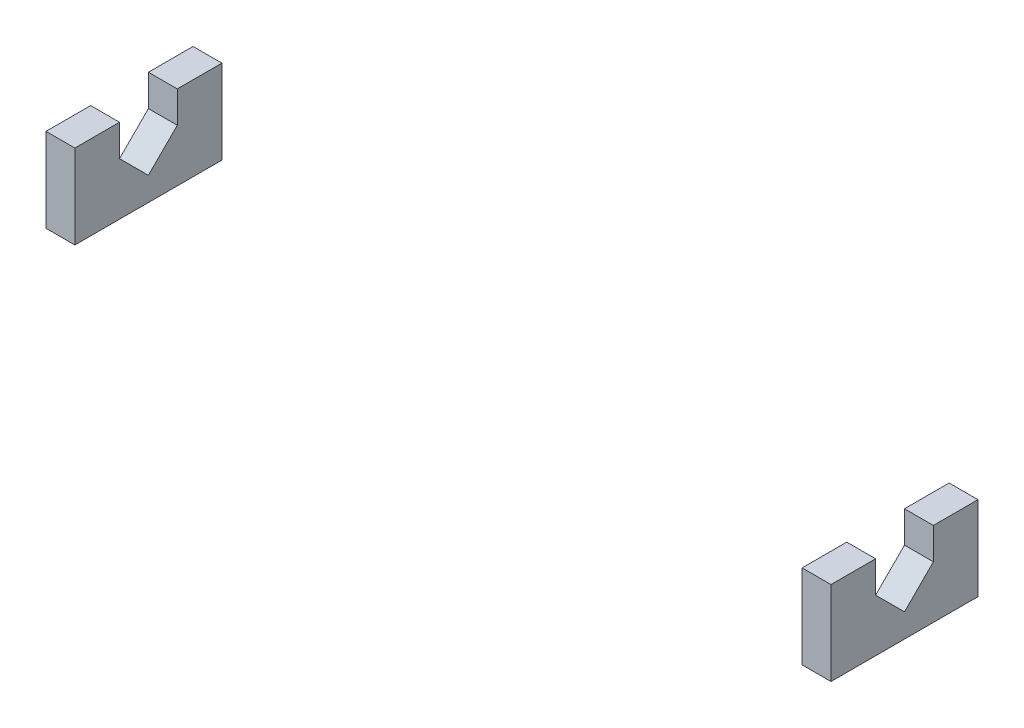
ISO-10303-21;
HEADER;
FILE_DESCRIPTION(('STEP AP214'),'2;1');
FILE_NAME('part.step','',(''),(''),'','','');
FILE_SCHEMA(('AUTOMOTIVE_DESIGN { 1 0 10303 214 1 1 1 1 }'));
ENDSEC;
DATA;
#1=APPLICATION_CONTEXT('core data for automotive mechanical design processes');
#2=APPLICATION_PROTOCOL_DEFINITION('international standard','automotive_design',2000,#1);
#3=PRODUCT_CONTEXT('',#1,'mechanical');
#4=PRODUCT('Part','Part','',(#3));
#5=PRODUCT_RELATED_PRODUCT_CATEGORY('part','',(#4));
#6=PRODUCT_DEFINITION_FORMATION('','',#4);
#7=PRODUCT_DEFINITION_CONTEXT('part definition',#1,'design');
#8=PRODUCT_DEFINITION('design','',#6,#7);
#9=PRODUCT_DEFINITION_SHAPE('','',#8);
#10=(LENGTH_UNIT() NAMED_UNIT(*) SI_UNIT(.MILLI.,.METRE.));
#11=(NAMED_UNIT(*) PLANE_ANGLE_UNIT() SI_UNIT($,.RADIAN.));
#12=(NAMED_UNIT(*) SI_UNIT($,.STERADIAN.) SOLID_ANGLE_UNIT());
#13=UNCERTAINTY_MEASURE_WITH_UNIT(LENGTH_MEASURE(1.E-05),#10,'distance_accuracy_value','');
#14=(GEOMETRIC_REPRESENTATION_CONTEXT(3) GLOBAL_UNCERTAINTY_ASSIGNED_CONTEXT((#13)) GLOBAL_UNIT_ASSIGNED_CONTEXT((#10,
#11,#12)) REPRESENTATION_CONTEXT('',''));
#15=CARTESIAN_POINT('',(0.,0.,0.));
#16=DIRECTION('',(0.,0.,1.));
#17=DIRECTION('',(1.,0.,0.));
#18=AXIS2_PLACEMENT_3D('',#15,#16,#17);
#19=CARTESIAN_POINT('',(474.6625,0.,-1.11022302462516E-13));
#20=DIRECTION('',(0.,0.,-1.));
#21=DIRECTION('',(0.,1.,0.));
#22=AXIS2_PLACEMENT_3D('',#19,#20,#21);
#23=PLANE('',#22);
#24=DIRECTION('',(0.,-1.,0.));
#25=VECTOR('',#24,1.);
#26=CARTESIAN_POINT('',(457.2,0.,-1.11022302462516E-13));
#27=LINE('',#26,#25);
#28=CARTESIAN_POINT('',(457.2,50.8,1.77367252013235E-13));
#29=VERTEX_POINT('',#28);
#30=CARTESIAN_POINT('',(457.2,0.,-1.11022302462516E-13));
#31=VERTEX_POINT('',#30);
#32=EDGE_CURVE('E149',#29,#31,#27,.T.);
#33=ORIENTED_EDGE('',*,*,#32,.T.);
#34=DIRECTION('',(-1.,0.,0.));
#35=VECTOR('',#34,1.);
#36=CARTESIAN_POINT('',(474.6625,0.,-1.11022302462516E-13));
#37=LINE('',#36,#35);
#38=CARTESIAN_POINT('',(474.6625,0.,-1.11022302462516E-13));
#39=VERTEX_POINT('',#38);
#40=EDGE_CURVE('E12',#39,#31,#37,.T.);
#41=ORIENTED_EDGE('',*,*,#40,.F.);
#42=DIRECTION('',(0.,-1.,0.));
#43=VECTOR('',#42,1.);
#44=CARTESIAN_POINT('',(474.6625,0.,-1.11022302462516E-13));
#45=LINE('',#44,#43);
#46=CARTESIAN_POINT('',(474.6625,50.8,1.77367252013235E-13));
#47=VERTEX_POINT('',#46);
#48=EDGE_CURVE('E165',#47,#39,#45,.T.);
#49=ORIENTED_EDGE('',*,*,#48,.F.);
#50=DIRECTION('',(-1.,0.,0.));
#51=VECTOR('',#50,1.);
#52=CARTESIAN_POINT('',(474.6625,50.8,1.77367252013235E-13));
#53=LINE('',#52,#51);
#54=EDGE_CURVE('E145',#47,#29,#53,.T.);
#55=ORIENTED_EDGE('',*,*,#54,.T.);
#56=EDGE_LOOP('',(#33,#41,#49,#55));
#57=FACE_BOUND('',#56,.T.);
#58=ADVANCED_FACE('F47',(#57),#23,.F.);
#59=CARTESIAN_POINT('',(474.6625,0.,-1.11022302462516E-13));
#60=DIRECTION('',(0.,1.,0.));
#61=DIRECTION('',(0.,0.,1.));
#62=AXIS2_PLACEMENT_3D('',#59,#60,#61);
#63=PLANE('',#62);
#64=DIRECTION('',(0.,0.,-1.));
#65=VECTOR('',#64,1.);
#66=CARTESIAN_POINT('',(457.2,0.,-1.11022302462516E-13));
#67=LINE('',#66,#65);
#68=CARTESIAN_POINT('',(457.2,3.04141951886577E-13,-88.9000000000001));
#69=VERTEX_POINT('',#68);
#70=EDGE_CURVE('E152',#31,#69,#67,.T.);
#71=ORIENTED_EDGE('',*,*,#70,.T.);
#72=DIRECTION('',(-1.,0.,0.));
#73=VECTOR('',#72,1.);
#74=CARTESIAN_POINT('',(474.6625,3.04141951886577E-13,-88.9000000000001));
#75=LINE('',#74,#73);
#76=CARTESIAN_POINT('',(474.6625,3.04141951886577E-13,-88.9000000000001));
#77=VERTEX_POINT('',#76);
#78=EDGE_CURVE('E55',#77,#69,#75,.T.);
#79=ORIENTED_EDGE('',*,*,#78,.F.);
#80=DIRECTION('',(0.,0.,-1.));
#81=VECTOR('',#80,1.);
#82=CARTESIAN_POINT('',(474.6625,0.,-1.11022302462516E-13));
#83=LINE('',#82,#81);
#84=EDGE_CURVE('E109',#39,#77,#83,.T.);
#85=ORIENTED_EDGE('',*,*,#84,.F.);
#86=ORIENTED_EDGE('',*,*,#40,.T.);
#87=EDGE_LOOP('',(#71,#79,#85,#86));
#88=FACE_BOUND('',#87,.T.);
#89=ADVANCED_FACE('F208',(#88),#63,.F.);
#90=CARTESIAN_POINT('',(474.6625,3.04141951886577E-13,-88.9000000000001));
#91=DIRECTION('',(0.,0.,1.));
#92=DIRECTION('',(0.,-1.,0.));
#93=AXIS2_PLACEMENT_3D('',#90,#91,#92);
#94=PLANE('',#93);
#95=DIRECTION('',(0.,1.,0.));
#96=VECTOR('',#95,1.);
#97=CARTESIAN_POINT('',(457.2,3.04141951886577E-13,-88.9000000000001));
#98=LINE('',#97,#96);
#99=CARTESIAN_POINT('',(457.2,50.8000000000003,-88.8999999999999));
#100=VERTEX_POINT('',#99);
#101=EDGE_CURVE('E154',#69,#100,#98,.T.);
#102=ORIENTED_EDGE('',*,*,#101,.T.);
#103=DIRECTION('',(-1.,0.,0.));
#104=VECTOR('',#103,1.);
#105=CARTESIAN_POINT('',(474.6625,50.8000000000003,-88.8999999999999));
#106=LINE('',#105,#104);
#107=CARTESIAN_POINT('',(474.6625,50.8000000000003,-88.8999999999999));
#108=VERTEX_POINT('',#107);
#109=EDGE_CURVE('E175',#108,#100,#106,.T.);
#110=ORIENTED_EDGE('',*,*,#109,.F.);
#111=DIRECTION('',(0.,1.,0.));
#112=VECTOR('',#111,1.);
#113=CARTESIAN_POINT('',(474.6625,3.04141951886577E-13,-88.9000000000001));
#114=LINE('',#113,#112);
#115=EDGE_CURVE('E183',#77,#108,#114,.T.);
#116=ORIENTED_EDGE('',*,*,#115,.F.);
#117=ORIENTED_EDGE('',*,*,#78,.T.);
#118=EDGE_LOOP('',(#102,#110,#116,#117));
#119=FACE_BOUND('',#118,.T.);
#120=ADVANCED_FACE('F181',(#119),#94,.F.);
#121=CARTESIAN_POINT('',(474.6625,50.8000000000002,-61.9124999999998));
#122=DIRECTION('',(0.,-1.,0.));
#123=DIRECTION('',(0.,0.,-1.));
#124=AXIS2_PLACEMENT_3D('',#121,#122,#123);
#125=PLANE('',#124);
#126=DIRECTION('',(0.,0.,1.));
#127=VECTOR('',#126,1.);
#128=CARTESIAN_POINT('',(457.2,50.8000000000002,-61.9124999999998));
#129=LINE('',#128,#127);
#130=CARTESIAN_POINT('',(457.2,50.8000000000002,-61.9124999999998));
#131=VERTEX_POINT('',#130);
#132=EDGE_CURVE('E156',#100,#131,#129,.T.);
#133=ORIENTED_EDGE('',*,*,#132,.T.);
#134=DIRECTION('',(-1.,0.,0.));
#135=VECTOR('',#134,1.);
#136=CARTESIAN_POINT('',(474.6625,50.8000000000002,-61.9124999999998));
#137=LINE('',#136,#135);
#138=CARTESIAN_POINT('',(474.6625,50.8000000000002,-61.9124999999998));
#139=VERTEX_POINT('',#138);
#140=EDGE_CURVE('E172',#139,#131,#137,.T.);
#141=ORIENTED_EDGE('',*,*,#140,.F.);
#142=DIRECTION('',(0.,0.,1.));
#143=VECTOR('',#142,1.);
#144=CARTESIAN_POINT('',(474.6625,50.8000000000002,-61.9124999999998));
#145=LINE('',#144,#143);
#146=EDGE_CURVE('E199',#108,#139,#145,.T.);
#147=ORIENTED_EDGE('',*,*,#146,.F.);
#148=ORIENTED_EDGE('',*,*,#109,.T.);
#149=EDGE_LOOP('',(#133,#141,#147,#148));
#150=FACE_BOUND('',#149,.T.);
#151=ADVANCED_FACE('F192',(#150),#125,.F.);
#152=CARTESIAN_POINT('',(474.6625,50.8000000000002,-61.9124999999998));
#153=DIRECTION('',(0.,0.,-1.));
#154=DIRECTION('',(0.,1.,0.));
#155=AXIS2_PLACEMENT_3D('',#152,#153,#154);
#156=PLANE('',#155);
#157=DIRECTION('',(0.,-1.,0.));
#158=VECTOR('',#157,1.);
#159=CARTESIAN_POINT('',(457.2,50.8000000000002,-61.9124999999998));
#160=LINE('',#159,#158);
#161=CARTESIAN_POINT('',(457.2,31.7500000000002,-61.9124999999999));
#162=VERTEX_POINT('',#161);
#163=EDGE_CURVE('E158',#131,#162,#160,.T.);
#164=ORIENTED_EDGE('',*,*,#163,.T.);
#165=DIRECTION('',(-1.,0.,0.));
#166=VECTOR('',#165,1.);
#167=CARTESIAN_POINT('',(474.6625,31.7500000000002,-61.9124999999999));
#168=LINE('',#167,#166);
#169=CARTESIAN_POINT('',(474.6625,31.7500000000002,-61.9124999999999));
#170=VERTEX_POINT('',#169);
#171=EDGE_CURVE('E169',#170,#162,#168,.T.);
#172=ORIENTED_EDGE('',*,*,#171,.F.);
#173=DIRECTION('',(0.,-1.,0.));
#174=VECTOR('',#173,1.);
#175=CARTESIAN_POINT('',(474.6625,50.8000000000002,-61.9124999999998));
#176=LINE('',#175,#174);
#177=EDGE_CURVE('E198',#139,#170,#176,.T.);
#178=ORIENTED_EDGE('',*,*,#177,.F.);
#179=ORIENTED_EDGE('',*,*,#140,.T.);
#180=EDGE_LOOP('',(#164,#172,#178,#179));
#181=FACE_BOUND('',#180,.T.);
#182=ADVANCED_FACE('F196',(#181),#156,.F.);
#183=CARTESIAN_POINT('',(474.6625,14.2875000000002,-44.4499999999999));
#184=DIRECTION('',(0.,-0.707106781186545,-0.70710678118655));
#185=DIRECTION('',(0.,0.70710678118655,-0.707106781186545));
#186=AXIS2_PLACEMENT_3D('',#183,#184,#185);
#187=PLANE('',#186);
#188=DIRECTION('',(0.,-0.70710678118655,0.707106781186545));
#189=VECTOR('',#188,1.);
#190=CARTESIAN_POINT('',(457.2,14.2875000000002,-44.4499999999999));
#191=LINE('',#190,#189);
#192=CARTESIAN_POINT('',(457.2,14.2875000000002,-44.4499999999999));
#193=VERTEX_POINT('',#192);
#194=EDGE_CURVE('E160',#162,#193,#191,.T.);
#195=ORIENTED_EDGE('',*,*,#194,.T.);
#196=DIRECTION('',(-1.,0.,0.));
#197=VECTOR('',#196,1.);
#198=CARTESIAN_POINT('',(474.6625,14.2875000000002,-44.4499999999999));
#199=LINE('',#198,#197);
#200=CARTESIAN_POINT('',(474.6625,14.2875000000002,-44.4499999999999));
#201=VERTEX_POINT('',#200);
#202=EDGE_CURVE('E140',#201,#193,#199,.T.);
#203=ORIENTED_EDGE('',*,*,#202,.F.);
#204=DIRECTION('',(0.,-0.70710678118655,0.707106781186545));
#205=VECTOR('',#204,1.);
#206=CARTESIAN_POINT('',(474.6625,14.2875000000002,-44.4499999999999));
#207=LINE('',#206,#205);
#208=EDGE_CURVE('E131',#170,#201,#207,.T.);
#209=ORIENTED_EDGE('',*,*,#208,.F.);
#210=ORIENTED_EDGE('',*,*,#171,.T.);
#211=EDGE_LOOP('',(#195,#203,#209,#210));
#212=FACE_BOUND('',#211,.T.);
#213=ADVANCED_FACE('F220',(#212),#187,.F.);
#214=CARTESIAN_POINT('',(474.6625,31.7500000000001,-26.9874999999999));
#215=DIRECTION('',(0.,-0.70710678118655,0.707106781186545));
#216=DIRECTION('',(0.,-0.707106781186545,-0.70710678118655));
#217=AXIS2_PLACEMENT_3D('',#214,#215,#216);
#218=PLANE('',#217);
#219=DIRECTION('',(0.,0.707106781186545,0.70710678118655));
#220=VECTOR('',#219,1.);
#221=CARTESIAN_POINT('',(457.2,31.7500000000001,-26.9874999999999));
#222=LINE('',#221,#220);
#223=CARTESIAN_POINT('',(457.2,31.7500000000001,-26.9874999999999));
#224=VERTEX_POINT('',#223);
#225=EDGE_CURVE('E139',#193,#224,#222,.T.);
#226=ORIENTED_EDGE('',*,*,#225,.T.);
#227=DIRECTION('',(-1.,0.,0.));
#228=VECTOR('',#227,1.);
#229=CARTESIAN_POINT('',(474.6625,31.7500000000001,-26.9874999999999));
#230=LINE('',#229,#228);
#231=CARTESIAN_POINT('',(474.6625,31.7500000000001,-26.9874999999999));
#232=VERTEX_POINT('',#231);
#233=EDGE_CURVE('E136',#232,#224,#230,.T.);
#234=ORIENTED_EDGE('',*,*,#233,.F.);
#235=DIRECTION('',(0.,0.707106781186545,0.70710678118655));
#236=VECTOR('',#235,1.);
#237=CARTESIAN_POINT('',(474.6625,31.7500000000001,-26.9874999999999));
#238=LINE('',#237,#236);
#239=EDGE_CURVE('E125',#201,#232,#238,.T.);
#240=ORIENTED_EDGE('',*,*,#239,.F.);
#241=ORIENTED_EDGE('',*,*,#202,.T.);
#242=EDGE_LOOP('',(#226,#234,#240,#241));
#243=FACE_BOUND('',#242,.T.);
#244=ADVANCED_FACE('F137',(#243),#218,.F.);
#245=CARTESIAN_POINT('',(474.6625,50.8000000000001,-26.9874999999998));
#246=DIRECTION('',(0.,0.,1.));
#247=DIRECTION('',(0.,-1.,0.));
#248=AXIS2_PLACEMENT_3D('',#245,#246,#247);
#249=PLANE('',#248);
#250=DIRECTION('',(0.,1.,0.));
#251=VECTOR('',#250,1.);
#252=CARTESIAN_POINT('',(457.2,50.8000000000001,-26.9874999999998));
#253=LINE('',#252,#251);
#254=CARTESIAN_POINT('',(457.2,50.8000000000001,-26.9874999999998));
#255=VERTEX_POINT('',#254);
#256=EDGE_CURVE('E95',#224,#255,#253,.T.);
#257=ORIENTED_EDGE('',*,*,#256,.T.);
#258=DIRECTION('',(-1.,0.,0.));
#259=VECTOR('',#258,1.);
#260=CARTESIAN_POINT('',(474.6625,50.8000000000001,-26.9874999999998));
#261=LINE('',#260,#259);
#262=CARTESIAN_POINT('',(474.6625,50.8000000000001,-26.9874999999998));
#263=VERTEX_POINT('',#262);
#264=EDGE_CURVE('E141',#263,#255,#261,.T.);
#265=ORIENTED_EDGE('',*,*,#264,.F.);
#266=DIRECTION('',(0.,1.,0.));
#267=VECTOR('',#266,1.);
#268=CARTESIAN_POINT('',(474.6625,50.8000000000001,-26.9874999999998));
#269=LINE('',#268,#267);
#270=EDGE_CURVE('E129',#232,#263,#269,.T.);
#271=ORIENTED_EDGE('',*,*,#270,.F.);
#272=ORIENTED_EDGE('',*,*,#233,.T.);
#273=EDGE_LOOP('',(#257,#265,#271,#272));
#274=FACE_BOUND('',#273,.T.);
#275=ADVANCED_FACE('F143',(#274),#249,.F.);
#276=CARTESIAN_POINT('',(474.6625,50.8,1.77367252013235E-13));
#277=DIRECTION('',(0.,-1.,0.));
#278=DIRECTION('',(0.,0.,-1.));
#279=AXIS2_PLACEMENT_3D('',#276,#277,#278);
#280=PLANE('',#279);
#281=DIRECTION('',(0.,0.,1.));
#282=VECTOR('',#281,1.);
#283=CARTESIAN_POINT('',(457.2,50.8,1.77367252013235E-13));
#284=LINE('',#283,#282);
#285=EDGE_CURVE('E101',#255,#29,#284,.T.);
#286=ORIENTED_EDGE('',*,*,#285,.T.);
#287=ORIENTED_EDGE('',*,*,#54,.F.);
#288=DIRECTION('',(0.,0.,1.));
#289=VECTOR('',#288,1.);
#290=CARTESIAN_POINT('',(474.6625,50.8,1.77367252013235E-13));
#291=LINE('',#290,#289);
#292=EDGE_CURVE('E63',#263,#47,#291,.T.);
#293=ORIENTED_EDGE('',*,*,#292,.F.);
#294=ORIENTED_EDGE('',*,*,#264,.T.);
#295=EDGE_LOOP('',(#286,#287,#293,#294));
#296=FACE_BOUND('',#295,.T.);
#297=ADVANCED_FACE('F228',(#296),#280,.F.);
#298=CARTESIAN_POINT('',(474.6625,0.,0.));
#299=DIRECTION('',(-1.,0.,0.));
#300=DIRECTION('',(0.,0.,1.));
#301=AXIS2_PLACEMENT_3D('',#298,#299,#300);
#302=PLANE('',#301);
#303=ORIENTED_EDGE('',*,*,#48,.T.);
#304=ORIENTED_EDGE('',*,*,#84,.T.);
#305=ORIENTED_EDGE('',*,*,#115,.T.);
#306=ORIENTED_EDGE('',*,*,#146,.T.);
#307=ORIENTED_EDGE('',*,*,#177,.T.);
#308=ORIENTED_EDGE('',*,*,#208,.T.);
#309=ORIENTED_EDGE('',*,*,#239,.T.);
#310=ORIENTED_EDGE('',*,*,#270,.T.);
#311=ORIENTED_EDGE('',*,*,#292,.T.);
#312=EDGE_LOOP('',(#303,#304,#305,#306,#307,#308,#309,#310,#311));
#313=FACE_BOUND('',#312,.T.);
#314=ADVANCED_FACE('F127',(#313),#302,.F.);
#315=CARTESIAN_POINT('',(457.2,0.,0.));
#316=DIRECTION('',(-1.,0.,0.));
#317=DIRECTION('',(0.,0.,1.));
#318=AXIS2_PLACEMENT_3D('',#315,#316,#317);
#319=PLANE('',#318);
#320=ORIENTED_EDGE('',*,*,#32,.F.);
#321=ORIENTED_EDGE('',*,*,#285,.F.);
#322=ORIENTED_EDGE('',*,*,#256,.F.);
#323=ORIENTED_EDGE('',*,*,#225,.F.);
#324=ORIENTED_EDGE('',*,*,#194,.F.);
#325=ORIENTED_EDGE('',*,*,#163,.F.);
#326=ORIENTED_EDGE('',*,*,#132,.F.);
#327=ORIENTED_EDGE('',*,*,#101,.F.);
#328=ORIENTED_EDGE('',*,*,#70,.F.);
#329=EDGE_LOOP('',(#320,#321,#322,#323,#324,#325,#326,#327,#328));
#330=FACE_BOUND('',#329,.T.);
#331=ADVANCED_FACE('F187',(#330),#319,.T.);
#332=CLOSED_SHELL('',(#58,#89,#120,#151,#182,#213,#244,#275,#297,#314,#331));
#333=MANIFOLD_SOLID_BREP('B2',#332);
#334=CARTESIAN_POINT('',(17.4625,0.,-1.11022302462516E-13));
#335=DIRECTION('',(0.,0.,-1.));
#336=DIRECTION('',(0.,1.,0.));
#337=AXIS2_PLACEMENT_3D('',#334,#335,#336);
#338=PLANE('',#337);
#339=DIRECTION('',(0.,-1.,0.));
#340=VECTOR('',#339,1.);
#341=CARTESIAN_POINT('',(0.,0.,-1.11022302462516E-13));
#342=LINE('',#341,#340);
#343=CARTESIAN_POINT('',(0.,50.8,1.77367252013235E-13));
#344=VERTEX_POINT('',#343);
#345=CARTESIAN_POINT('',(0.,0.,-1.11022302462516E-13));
#346=VERTEX_POINT('',#345);
#347=EDGE_CURVE('E403',#344,#346,#342,.T.);
#348=ORIENTED_EDGE('',*,*,#347,.T.);
#349=DIRECTION('',(-1.,0.,0.));
#350=VECTOR('',#349,1.);
#351=CARTESIAN_POINT('',(17.4625,0.,-1.11022302462516E-13));
#352=LINE('',#351,#350);
#353=CARTESIAN_POINT('',(17.4625,0.,-1.11022302462516E-13));
#354=VERTEX_POINT('',#353);
#355=EDGE_CURVE('E45',#354,#346,#352,.T.);
#356=ORIENTED_EDGE('',*,*,#355,.F.);
#357=DIRECTION('',(0.,-1.,0.));
#358=VECTOR('',#357,1.);
#359=CARTESIAN_POINT('',(17.4625,0.,-1.11022302462516E-13));
#360=LINE('',#359,#358);
#361=CARTESIAN_POINT('',(17.4625,50.8,1.77367252013235E-13));
#362=VERTEX_POINT('',#361);
#363=EDGE_CURVE('E419',#362,#354,#360,.T.);
#364=ORIENTED_EDGE('',*,*,#363,.F.);
#365=DIRECTION('',(-1.,0.,0.));
#366=VECTOR('',#365,1.);
#367=CARTESIAN_POINT('',(17.4625,50.8,1.77367252013235E-13));
#368=LINE('',#367,#366);
#369=EDGE_CURVE('E399',#362,#344,#368,.T.);
#370=ORIENTED_EDGE('',*,*,#369,.T.);
#371=EDGE_LOOP('',(#348,#356,#364,#370));
#372=FACE_BOUND('',#371,.T.);
#373=ADVANCED_FACE('F301',(#372),#338,.F.);
#374=CARTESIAN_POINT('',(17.4625,0.,-1.11022302462516E-13));
#375=DIRECTION('',(0.,1.,0.));
#376=DIRECTION('',(0.,0.,1.));
#377=AXIS2_PLACEMENT_3D('',#374,#375,#376);
#378=PLANE('',#377);
#379=DIRECTION('',(0.,0.,-1.));
#380=VECTOR('',#379,1.);
#381=CARTESIAN_POINT('',(0.,0.,-1.11022302462516E-13));
#382=LINE('',#381,#380);
#383=CARTESIAN_POINT('',(0.,3.04141951886577E-13,-88.9000000000001));
#384=VERTEX_POINT('',#383);
#385=EDGE_CURVE('E406',#346,#384,#382,.T.);
#386=ORIENTED_EDGE('',*,*,#385,.T.);
#387=DIRECTION('',(-1.,0.,0.));
#388=VECTOR('',#387,1.);
#389=CARTESIAN_POINT('',(17.4625,3.04141951886577E-13,-88.9000000000001));
#390=LINE('',#389,#388);
#391=CARTESIAN_POINT('',(17.4625,3.04141951886577E-13,-88.9000000000001));
#392=VERTEX_POINT('',#391);
#393=EDGE_CURVE('E309',#392,#384,#390,.T.);
#394=ORIENTED_EDGE('',*,*,#393,.F.);
#395=DIRECTION('',(0.,0.,-1.));
#396=VECTOR('',#395,1.);
#397=CARTESIAN_POINT('',(17.4625,0.,-1.11022302462516E-13));
#398=LINE('',#397,#396);
#399=EDGE_CURVE('E363',#354,#392,#398,.T.);
#400=ORIENTED_EDGE('',*,*,#399,.F.);
#401=ORIENTED_EDGE('',*,*,#355,.T.);
#402=EDGE_LOOP('',(#386,#394,#400,#401));
#403=FACE_BOUND('',#402,.T.);
#404=ADVANCED_FACE('F462',(#403),#378,.F.);
#405=CARTESIAN_POINT('',(17.4625,3.04141951886577E-13,-88.9000000000001));
#406=DIRECTION('',(0.,0.,1.));
#407=DIRECTION('',(0.,-1.,0.));
#408=AXIS2_PLACEMENT_3D('',#405,#406,#407);
#409=PLANE('',#408);
#410=DIRECTION('',(0.,1.,0.));
#411=VECTOR('',#410,1.);
#412=CARTESIAN_POINT('',(0.,3.04141951886577E-13,-88.9000000000001));
#413=LINE('',#412,#411);
#414=CARTESIAN_POINT('',(0.,50.8000000000003,-88.8999999999999));
#415=VERTEX_POINT('',#414);
#416=EDGE_CURVE('E408',#384,#415,#413,.T.);
#417=ORIENTED_EDGE('',*,*,#416,.T.);
#418=DIRECTION('',(-1.,0.,0.));
#419=VECTOR('',#418,1.);
#420=CARTESIAN_POINT('',(17.4625,50.8000000000003,-88.8999999999999));
#421=LINE('',#420,#419);
#422=CARTESIAN_POINT('',(17.4625,50.8000000000003,-88.8999999999999));
#423=VERTEX_POINT('',#422);
#424=EDGE_CURVE('E429',#423,#415,#421,.T.);
#425=ORIENTED_EDGE('',*,*,#424,.F.);
#426=DIRECTION('',(0.,1.,0.));
#427=VECTOR('',#426,1.);
#428=CARTESIAN_POINT('',(17.4625,3.04141951886577E-13,-88.9000000000001));
#429=LINE('',#428,#427);
#430=EDGE_CURVE('E437',#392,#423,#429,.T.);
#431=ORIENTED_EDGE('',*,*,#430,.F.);
#432=ORIENTED_EDGE('',*,*,#393,.T.);
#433=EDGE_LOOP('',(#417,#425,#431,#432));
#434=FACE_BOUND('',#433,.T.);
#435=ADVANCED_FACE('F435',(#434),#409,.F.);
#436=CARTESIAN_POINT('',(17.4625,50.8000000000002,-61.9124999999998));
#437=DIRECTION('',(0.,-1.,0.));
#438=DIRECTION('',(0.,0.,-1.));
#439=AXIS2_PLACEMENT_3D('',#436,#437,#438);
#440=PLANE('',#439);
#441=DIRECTION('',(0.,0.,1.));
#442=VECTOR('',#441,1.);
#443=CARTESIAN_POINT('',(0.,50.8000000000002,-61.9124999999998));
#444=LINE('',#443,#442);
#445=CARTESIAN_POINT('',(0.,50.8000000000002,-61.9124999999998));
#446=VERTEX_POINT('',#445);
#447=EDGE_CURVE('E410',#415,#446,#444,.T.);
#448=ORIENTED_EDGE('',*,*,#447,.T.);
#449=DIRECTION('',(-1.,0.,0.));
#450=VECTOR('',#449,1.);
#451=CARTESIAN_POINT('',(17.4625,50.8000000000002,-61.9124999999998));
#452=LINE('',#451,#450);
#453=CARTESIAN_POINT('',(17.4625,50.8000000000002,-61.9124999999998));
#454=VERTEX_POINT('',#453);
#455=EDGE_CURVE('E426',#454,#446,#452,.T.);
#456=ORIENTED_EDGE('',*,*,#455,.F.);
#457=DIRECTION('',(0.,0.,1.));
#458=VECTOR('',#457,1.);
#459=CARTESIAN_POINT('',(17.4625,50.8000000000002,-61.9124999999998));
#460=LINE('',#459,#458);
#461=EDGE_CURVE('E453',#423,#454,#460,.T.);
#462=ORIENTED_EDGE('',*,*,#461,.F.);
#463=ORIENTED_EDGE('',*,*,#424,.T.);
#464=EDGE_LOOP('',(#448,#456,#462,#463));
#465=FACE_BOUND('',#464,.T.);
#466=ADVANCED_FACE('F446',(#465),#440,.F.);
#467=CARTESIAN_POINT('',(17.4625,50.8000000000002,-61.9124999999998));
#468=DIRECTION('',(0.,0.,-1.));
#469=DIRECTION('',(0.,1.,0.));
#470=AXIS2_PLACEMENT_3D('',#467,#468,#469);
#471=PLANE('',#470);
#472=DIRECTION('',(0.,-1.,0.));
#473=VECTOR('',#472,1.);
#474=CARTESIAN_POINT('',(0.,50.8000000000002,-61.9124999999998));
#475=LINE('',#474,#473);
#476=CARTESIAN_POINT('',(0.,31.7500000000002,-61.9124999999999));
#477=VERTEX_POINT('',#476);
#478=EDGE_CURVE('E412',#446,#477,#475,.T.);
#479=ORIENTED_EDGE('',*,*,#478,.T.);
#480=DIRECTION('',(-1.,0.,0.));
#481=VECTOR('',#480,1.);
#482=CARTESIAN_POINT('',(17.4625,31.7500000000002,-61.9124999999999));
#483=LINE('',#482,#481);
#484=CARTESIAN_POINT('',(17.4625,31.7500000000002,-61.9124999999999));
#485=VERTEX_POINT('',#484);
#486=EDGE_CURVE('E423',#485,#477,#483,.T.);
#487=ORIENTED_EDGE('',*,*,#486,.F.);
#488=DIRECTION('',(0.,-1.,0.));
#489=VECTOR('',#488,1.);
#490=CARTESIAN_POINT('',(17.4625,50.8000000000002,-61.9124999999998));
#491=LINE('',#490,#489);
#492=EDGE_CURVE('E452',#454,#485,#491,.T.);
#493=ORIENTED_EDGE('',*,*,#492,.F.);
#494=ORIENTED_EDGE('',*,*,#455,.T.);
#495=EDGE_LOOP('',(#479,#487,#493,#494));
#496=FACE_BOUND('',#495,.T.);
#497=ADVANCED_FACE('F450',(#496),#471,.F.);
#498=CARTESIAN_POINT('',(17.4625,14.2875000000002,-44.4499999999999));
#499=DIRECTION('',(0.,-0.707106781186545,-0.70710678118655));
#500=DIRECTION('',(0.,0.70710678118655,-0.707106781186545));
#501=AXIS2_PLACEMENT_3D('',#498,#499,#500);
#502=PLANE('',#501);
#503=DIRECTION('',(0.,-0.70710678118655,0.707106781186545));
#504=VECTOR('',#503,1.);
#505=CARTESIAN_POINT('',(0.,14.2875000000002,-44.4499999999999));
#506=LINE('',#505,#504);
#507=CARTESIAN_POINT('',(0.,14.2875000000002,-44.4499999999999));
#508=VERTEX_POINT('',#507);
#509=EDGE_CURVE('E414',#477,#508,#506,.T.);
#510=ORIENTED_EDGE('',*,*,#509,.T.);
#511=DIRECTION('',(-1.,0.,0.));
#512=VECTOR('',#511,1.);
#513=CARTESIAN_POINT('',(17.4625,14.2875000000002,-44.4499999999999));
#514=LINE('',#513,#512);
#515=CARTESIAN_POINT('',(17.4625,14.2875000000002,-44.4499999999999));
#516=VERTEX_POINT('',#515);
#517=EDGE_CURVE('E394',#516,#508,#514,.T.);
#518=ORIENTED_EDGE('',*,*,#517,.F.);
#519=DIRECTION('',(0.,-0.70710678118655,0.707106781186545));
#520=VECTOR('',#519,1.);
#521=CARTESIAN_POINT('',(17.4625,14.2875000000002,-44.4499999999999));
#522=LINE('',#521,#520);
#523=EDGE_CURVE('E385',#485,#516,#522,.T.);
#524=ORIENTED_EDGE('',*,*,#523,.F.);
#525=ORIENTED_EDGE('',*,*,#486,.T.);
#526=EDGE_LOOP('',(#510,#518,#524,#525));
#527=FACE_BOUND('',#526,.T.);
#528=ADVANCED_FACE('F474',(#527),#502,.F.);
#529=CARTESIAN_POINT('',(17.4625,31.7500000000001,-26.9874999999999));
#530=DIRECTION('',(0.,-0.70710678118655,0.707106781186545));
#531=DIRECTION('',(0.,-0.707106781186545,-0.70710678118655));
#532=AXIS2_PLACEMENT_3D('',#529,#530,#531);
#533=PLANE('',#532);
#534=DIRECTION('',(0.,0.707106781186545,0.70710678118655));
#535=VECTOR('',#534,1.);
#536=CARTESIAN_POINT('',(0.,31.7500000000001,-26.9874999999999));
#537=LINE('',#536,#535);
#538=CARTESIAN_POINT('',(0.,31.7500000000001,-26.9874999999999));
#539=VERTEX_POINT('',#538);
#540=EDGE_CURVE('E393',#508,#539,#537,.T.);
#541=ORIENTED_EDGE('',*,*,#540,.T.);
#542=DIRECTION('',(-1.,0.,0.));
#543=VECTOR('',#542,1.);
#544=CARTESIAN_POINT('',(17.4625,31.7500000000001,-26.9874999999999));
#545=LINE('',#544,#543);
#546=CARTESIAN_POINT('',(17.4625,31.7500000000001,-26.9874999999999));
#547=VERTEX_POINT('',#546);
#548=EDGE_CURVE('E390',#547,#539,#545,.T.);
#549=ORIENTED_EDGE('',*,*,#548,.F.);
#550=DIRECTION('',(0.,0.707106781186545,0.70710678118655));
#551=VECTOR('',#550,1.);
#552=CARTESIAN_POINT('',(17.4625,31.7500000000001,-26.9874999999999));
#553=LINE('',#552,#551);
#554=EDGE_CURVE('E379',#516,#547,#553,.T.);
#555=ORIENTED_EDGE('',*,*,#554,.F.);
#556=ORIENTED_EDGE('',*,*,#517,.T.);
#557=EDGE_LOOP('',(#541,#549,#555,#556));
#558=FACE_BOUND('',#557,.T.);
#559=ADVANCED_FACE('F391',(#558),#533,.F.);
#560=CARTESIAN_POINT('',(17.4625,50.8000000000001,-26.9874999999998));
#561=DIRECTION('',(0.,0.,1.));
#562=DIRECTION('',(0.,-1.,0.));
#563=AXIS2_PLACEMENT_3D('',#560,#561,#562);
#564=PLANE('',#563);
#565=DIRECTION('',(0.,1.,0.));
#566=VECTOR('',#565,1.);
#567=CARTESIAN_POINT('',(0.,50.8000000000001,-26.9874999999998));
#568=LINE('',#567,#566);
#569=CARTESIAN_POINT('',(0.,50.8000000000001,-26.9874999999998));
#570=VERTEX_POINT('',#569);
#571=EDGE_CURVE('E349',#539,#570,#568,.T.);
#572=ORIENTED_EDGE('',*,*,#571,.T.);
#573=DIRECTION('',(-1.,0.,0.));
#574=VECTOR('',#573,1.);
#575=CARTESIAN_POINT('',(17.4625,50.8000000000001,-26.9874999999998));
#576=LINE('',#575,#574);
#577=CARTESIAN_POINT('',(17.4625,50.8000000000001,-26.9874999999998));
#578=VERTEX_POINT('',#577);
#579=EDGE_CURVE('E395',#578,#570,#576,.T.);
#580=ORIENTED_EDGE('',*,*,#579,.F.);
#581=DIRECTION('',(0.,1.,0.));
#582=VECTOR('',#581,1.);
#583=CARTESIAN_POINT('',(17.4625,50.8000000000001,-26.9874999999998));
#584=LINE('',#583,#582);
#585=EDGE_CURVE('E383',#547,#578,#584,.T.);
#586=ORIENTED_EDGE('',*,*,#585,.F.);
#587=ORIENTED_EDGE('',*,*,#548,.T.);
#588=EDGE_LOOP('',(#572,#580,#586,#587));
#589=FACE_BOUND('',#588,.T.);
#590=ADVANCED_FACE('F397',(#589),#564,.F.);
#591=CARTESIAN_POINT('',(17.4625,50.8,1.77367252013235E-13));
#592=DIRECTION('',(0.,-1.,0.));
#593=DIRECTION('',(0.,0.,-1.));
#594=AXIS2_PLACEMENT_3D('',#591,#592,#593);
#595=PLANE('',#594);
#596=DIRECTION('',(0.,0.,1.));
#597=VECTOR('',#596,1.);
#598=CARTESIAN_POINT('',(0.,50.8,1.77367252013235E-13));
#599=LINE('',#598,#597);
#600=EDGE_CURVE('E355',#570,#344,#599,.T.);
#601=ORIENTED_EDGE('',*,*,#600,.T.);
#602=ORIENTED_EDGE('',*,*,#369,.F.);
#603=DIRECTION('',(0.,0.,1.));
#604=VECTOR('',#603,1.);
#605=CARTESIAN_POINT('',(17.4625,50.8,1.77367252013235E-13));
#606=LINE('',#605,#604);
#607=EDGE_CURVE('E317',#578,#362,#606,.T.);
#608=ORIENTED_EDGE('',*,*,#607,.F.);
#609=ORIENTED_EDGE('',*,*,#579,.T.);
#610=EDGE_LOOP('',(#601,#602,#608,#609));
#611=FACE_BOUND('',#610,.T.);
#612=ADVANCED_FACE('F482',(#611),#595,.F.);
#613=CARTESIAN_POINT('',(17.4625,0.,0.));
#614=DIRECTION('',(-1.,0.,0.));
#615=DIRECTION('',(0.,0.,1.));
#616=AXIS2_PLACEMENT_3D('',#613,#614,#615);
#617=PLANE('',#616);
#618=ORIENTED_EDGE('',*,*,#363,.T.);
#619=ORIENTED_EDGE('',*,*,#399,.T.);
#620=ORIENTED_EDGE('',*,*,#430,.T.);
#621=ORIENTED_EDGE('',*,*,#461,.T.);
#622=ORIENTED_EDGE('',*,*,#492,.T.);
#623=ORIENTED_EDGE('',*,*,#523,.T.);
#624=ORIENTED_EDGE('',*,*,#554,.T.);
#625=ORIENTED_EDGE('',*,*,#585,.T.);
#626=ORIENTED_EDGE('',*,*,#607,.T.);
#627=EDGE_LOOP('',(#618,#619,#620,#621,#622,#623,#624,#625,#626));
#628=FACE_BOUND('',#627,.T.);
#629=ADVANCED_FACE('F381',(#628),#617,.F.);
#630=CARTESIAN_POINT('',(0.,0.,0.));
#631=DIRECTION('',(-1.,0.,0.));
#632=DIRECTION('',(0.,0.,1.));
#633=AXIS2_PLACEMENT_3D('',#630,#631,#632);
#634=PLANE('',#633);
#635=ORIENTED_EDGE('',*,*,#347,.F.);
#636=ORIENTED_EDGE('',*,*,#600,.F.);
#637=ORIENTED_EDGE('',*,*,#571,.F.);
#638=ORIENTED_EDGE('',*,*,#540,.F.);
#639=ORIENTED_EDGE('',*,*,#509,.F.);
#640=ORIENTED_EDGE('',*,*,#478,.F.);
#641=ORIENTED_EDGE('',*,*,#447,.F.);
#642=ORIENTED_EDGE('',*,*,#416,.F.);
#643=ORIENTED_EDGE('',*,*,#385,.F.);
#644=EDGE_LOOP('',(#635,#636,#637,#638,#639,#640,#641,#642,#643));
#645=FACE_BOUND('',#644,.T.);
#646=ADVANCED_FACE('F441',(#645),#634,.T.);
#647=CLOSED_SHELL('',(#373,#404,#435,#466,#497,#528,#559,#590,#612,#629,#646));
#648=MANIFOLD_SOLID_BREP('B6',#647);
#649=ADVANCED_BREP_SHAPE_REPRESENTATION('',(#18,#333,#648),#14);
#650=SHAPE_DEFINITION_REPRESENTATION(#9,#649);
ENDSEC;
END-ISO-10303-21;
